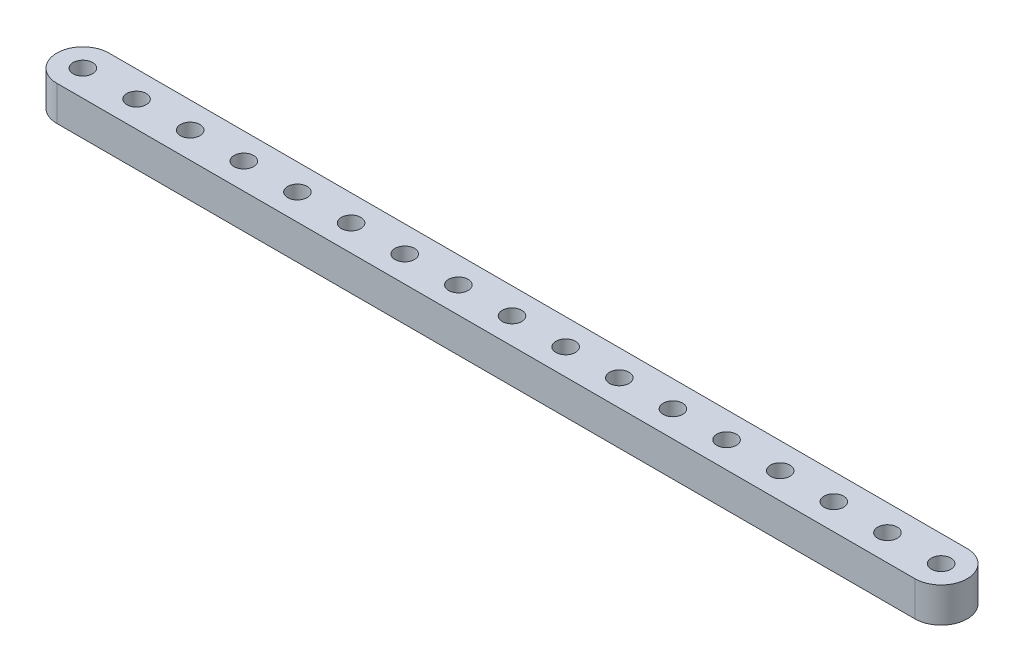
ISO-10303-21;
HEADER;
FILE_DESCRIPTION(('STEP AP214'),'2;1');
FILE_NAME('part.step','',(''),(''),'','','');
FILE_SCHEMA(('AUTOMOTIVE_DESIGN { 1 0 10303 214 1 1 1 1 }'));
ENDSEC;
DATA;
#1=APPLICATION_CONTEXT('core data for automotive mechanical design processes');
#2=APPLICATION_PROTOCOL_DEFINITION('international standard','automotive_design',2000,#1);
#3=PRODUCT_CONTEXT('',#1,'mechanical');
#4=PRODUCT('Part','Part','',(#3));
#5=PRODUCT_RELATED_PRODUCT_CATEGORY('part','',(#4));
#6=PRODUCT_DEFINITION_FORMATION('','',#4);
#7=PRODUCT_DEFINITION_CONTEXT('part definition',#1,'design');
#8=PRODUCT_DEFINITION('design','',#6,#7);
#9=PRODUCT_DEFINITION_SHAPE('','',#8);
#10=(LENGTH_UNIT() NAMED_UNIT(*) SI_UNIT(.MILLI.,.METRE.));
#11=(NAMED_UNIT(*) PLANE_ANGLE_UNIT() SI_UNIT($,.RADIAN.));
#12=(NAMED_UNIT(*) SI_UNIT($,.STERADIAN.) SOLID_ANGLE_UNIT());
#13=UNCERTAINTY_MEASURE_WITH_UNIT(LENGTH_MEASURE(1.E-05),#10,'distance_accuracy_value','');
#14=(GEOMETRIC_REPRESENTATION_CONTEXT(3) GLOBAL_UNCERTAINTY_ASSIGNED_CONTEXT((#13)) GLOBAL_UNIT_ASSIGNED_CONTEXT((#10,
#11,#12)) REPRESENTATION_CONTEXT('',''));
#15=CARTESIAN_POINT('',(0.,0.,0.));
#16=DIRECTION('',(0.,0.,1.));
#17=DIRECTION('',(1.,0.,0.));
#18=AXIS2_PLACEMENT_3D('',#15,#16,#17);
#19=CARTESIAN_POINT('',(78.232,0.,0.));
#20=DIRECTION('',(0.,1.,0.));
#21=DIRECTION('',(0.,0.,1.));
#22=AXIS2_PLACEMENT_3D('',#19,#20,#21);
#23=CYLINDRICAL_SURFACE('',#22,4.76250000000002);
#24=CARTESIAN_POINT('',(78.232,6.35,0.));
#25=DIRECTION('',(0.,1.,0.));
#26=DIRECTION('',(0.,0.,1.));
#27=AXIS2_PLACEMENT_3D('',#24,#25,#26);
#28=CIRCLE('',#27,4.76250000000002);
#29=CARTESIAN_POINT('',(78.232,6.35,4.76250000000002));
#30=VERTEX_POINT('',#29);
#31=CARTESIAN_POINT('',(78.232,6.35,-4.76250000000002));
#32=VERTEX_POINT('',#31);
#33=EDGE_CURVE('E101',#30,#32,#28,.T.);
#34=ORIENTED_EDGE('',*,*,#33,.F.);
#35=DIRECTION('',(0.,1.,0.));
#36=VECTOR('',#35,1.);
#37=CARTESIAN_POINT('',(78.232,0.,4.76250000000002));
#38=LINE('',#37,#36);
#39=CARTESIAN_POINT('',(78.232,0.,4.76250000000002));
#40=VERTEX_POINT('',#39);
#41=EDGE_CURVE('E11',#40,#30,#38,.T.);
#42=ORIENTED_EDGE('',*,*,#41,.F.);
#43=CARTESIAN_POINT('',(78.232,0.,0.));
#44=DIRECTION('',(0.,1.,0.));
#45=DIRECTION('',(0.,0.,1.));
#46=AXIS2_PLACEMENT_3D('',#43,#44,#45);
#47=CIRCLE('',#46,4.76250000000002);
#48=CARTESIAN_POINT('',(78.232,0.,-4.76250000000002));
#49=VERTEX_POINT('',#48);
#50=EDGE_CURVE('E94',#40,#49,#47,.T.);
#51=ORIENTED_EDGE('',*,*,#50,.T.);
#52=DIRECTION('',(0.,1.,0.));
#53=VECTOR('',#52,1.);
#54=CARTESIAN_POINT('',(78.232,0.,-4.76250000000002));
#55=LINE('',#54,#53);
#56=EDGE_CURVE('E39',#49,#32,#55,.T.);
#57=ORIENTED_EDGE('',*,*,#56,.T.);
#58=EDGE_LOOP('',(#34,#42,#51,#57));
#59=FACE_BOUND('',#58,.T.);
#60=ADVANCED_FACE('F36',(#59),#23,.T.);
#61=CARTESIAN_POINT('',(-78.232,0.,4.76250000000002));
#62=DIRECTION('',(0.,0.,1.));
#63=DIRECTION('',(1.,0.,0.));
#64=AXIS2_PLACEMENT_3D('',#61,#62,#63);
#65=PLANE('',#64);
#66=DIRECTION('',(1.,0.,0.));
#67=VECTOR('',#66,1.);
#68=CARTESIAN_POINT('',(-78.232,6.35,4.76250000000002));
#69=LINE('',#68,#67);
#70=CARTESIAN_POINT('',(-78.232,6.35,4.76250000000002));
#71=VERTEX_POINT('',#70);
#72=EDGE_CURVE('E96',#71,#30,#69,.T.);
#73=ORIENTED_EDGE('',*,*,#72,.F.);
#74=DIRECTION('',(0.,1.,0.));
#75=VECTOR('',#74,1.);
#76=CARTESIAN_POINT('',(-78.232,0.,4.76250000000002));
#77=LINE('',#76,#75);
#78=CARTESIAN_POINT('',(-78.232,0.,4.76250000000002));
#79=VERTEX_POINT('',#78);
#80=EDGE_CURVE('E45',#79,#71,#77,.T.);
#81=ORIENTED_EDGE('',*,*,#80,.F.);
#82=DIRECTION('',(1.,0.,0.));
#83=VECTOR('',#82,1.);
#84=CARTESIAN_POINT('',(-78.232,0.,4.76250000000002));
#85=LINE('',#84,#83);
#86=EDGE_CURVE('E91',#79,#40,#85,.T.);
#87=ORIENTED_EDGE('',*,*,#86,.T.);
#88=ORIENTED_EDGE('',*,*,#41,.T.);
#89=EDGE_LOOP('',(#73,#81,#87,#88));
#90=FACE_BOUND('',#89,.T.);
#91=ADVANCED_FACE('F112',(#90),#65,.T.);
#92=CARTESIAN_POINT('',(-78.232,0.,0.));
#93=DIRECTION('',(0.,1.,0.));
#94=DIRECTION('',(0.,0.,1.));
#95=AXIS2_PLACEMENT_3D('',#92,#93,#94);
#96=CYLINDRICAL_SURFACE('',#95,4.76250000000001);
#97=CARTESIAN_POINT('',(-78.232,6.35,0.));
#98=DIRECTION('',(0.,1.,0.));
#99=DIRECTION('',(0.,0.,1.));
#100=AXIS2_PLACEMENT_3D('',#97,#98,#99);
#101=CIRCLE('',#100,4.76250000000001);
#102=CARTESIAN_POINT('',(-78.232,6.35,-4.7625));
#103=VERTEX_POINT('',#102);
#104=EDGE_CURVE('E86',#103,#71,#101,.T.);
#105=ORIENTED_EDGE('',*,*,#104,.F.);
#106=DIRECTION('',(0.,1.,0.));
#107=VECTOR('',#106,1.);
#108=CARTESIAN_POINT('',(-78.232,0.,-4.7625));
#109=LINE('',#108,#107);
#110=CARTESIAN_POINT('',(-78.232,0.,-4.7625));
#111=VERTEX_POINT('',#110);
#112=EDGE_CURVE('E81',#111,#103,#109,.T.);
#113=ORIENTED_EDGE('',*,*,#112,.F.);
#114=CARTESIAN_POINT('',(-78.232,0.,0.));
#115=DIRECTION('',(0.,1.,0.));
#116=DIRECTION('',(0.,0.,1.));
#117=AXIS2_PLACEMENT_3D('',#114,#115,#116);
#118=CIRCLE('',#117,4.76250000000001);
#119=EDGE_CURVE('E84',#111,#79,#118,.T.);
#120=ORIENTED_EDGE('',*,*,#119,.T.);
#121=ORIENTED_EDGE('',*,*,#80,.T.);
#122=EDGE_LOOP('',(#105,#113,#120,#121));
#123=FACE_BOUND('',#122,.T.);
#124=ADVANCED_FACE('F83',(#123),#96,.T.);
#125=CARTESIAN_POINT('',(78.232,0.,-4.76250000000002));
#126=DIRECTION('',(0.,0.,-1.));
#127=DIRECTION('',(-1.,0.,0.));
#128=AXIS2_PLACEMENT_3D('',#125,#126,#127);
#129=PLANE('',#128);
#130=DIRECTION('',(-1.,0.,0.));
#131=VECTOR('',#130,1.);
#132=CARTESIAN_POINT('',(78.232,6.35,-4.76250000000002));
#133=LINE('',#132,#131);
#134=EDGE_CURVE('E104',#32,#103,#133,.T.);
#135=ORIENTED_EDGE('',*,*,#134,.F.);
#136=ORIENTED_EDGE('',*,*,#56,.F.);
#137=DIRECTION('',(-1.,0.,0.));
#138=VECTOR('',#137,1.);
#139=CARTESIAN_POINT('',(78.232,0.,-4.76250000000002));
#140=LINE('',#139,#138);
#141=EDGE_CURVE('E90',#49,#111,#140,.T.);
#142=ORIENTED_EDGE('',*,*,#141,.T.);
#143=ORIENTED_EDGE('',*,*,#112,.T.);
#144=EDGE_LOOP('',(#135,#136,#142,#143));
#145=FACE_BOUND('',#144,.T.);
#146=ADVANCED_FACE('F93',(#145),#129,.T.);
#147=CARTESIAN_POINT('',(78.232,0.,0.));
#148=DIRECTION('',(0.,1.,0.));
#149=DIRECTION('',(0.,0.,1.));
#150=AXIS2_PLACEMENT_3D('',#147,#148,#149);
#151=PLANE('',#150);
#152=CARTESIAN_POINT('',(-78.232,0.,0.));
#153=DIRECTION('',(0.,1.,0.));
#154=DIRECTION('',(0.,0.,-1.));
#155=AXIS2_PLACEMENT_3D('',#152,#153,#154);
#156=CIRCLE('',#155,1.77799999999997);
#157=CARTESIAN_POINT('',(-78.232,0.,-1.77799999999996));
#158=VERTEX_POINT('',#157);
#159=EDGE_CURVE('E205',#158,#158,#156,.T.);
#160=ORIENTED_EDGE('',*,*,#159,.T.);
#161=EDGE_LOOP('',(#160));
#162=FACE_BOUND('',#161,.T.);
#163=CARTESIAN_POINT('',(-68.453,0.,0.));
#164=DIRECTION('',(0.,1.,0.));
#165=DIRECTION('',(0.,0.,-1.));
#166=AXIS2_PLACEMENT_3D('',#163,#164,#165);
#167=CIRCLE('',#166,1.77799999999999);
#168=CARTESIAN_POINT('',(-68.453,0.,-1.77799999999999));
#169=VERTEX_POINT('',#168);
#170=EDGE_CURVE('E213',#169,#169,#167,.T.);
#171=ORIENTED_EDGE('',*,*,#170,.T.);
#172=EDGE_LOOP('',(#171));
#173=FACE_BOUND('',#172,.T.);
#174=CARTESIAN_POINT('',(-58.674,0.,0.));
#175=DIRECTION('',(0.,1.,0.));
#176=DIRECTION('',(0.,0.,-1.));
#177=AXIS2_PLACEMENT_3D('',#174,#175,#176);
#178=CIRCLE('',#177,1.77799999999999);
#179=CARTESIAN_POINT('',(-58.674,0.,-1.77799999999999));
#180=VERTEX_POINT('',#179);
#181=EDGE_CURVE('E219',#180,#180,#178,.T.);
#182=ORIENTED_EDGE('',*,*,#181,.T.);
#183=EDGE_LOOP('',(#182));
#184=FACE_BOUND('',#183,.T.);
#185=CARTESIAN_POINT('',(-48.895,0.,0.));
#186=DIRECTION('',(0.,1.,0.));
#187=DIRECTION('',(0.,0.,-1.));
#188=AXIS2_PLACEMENT_3D('',#185,#186,#187);
#189=CIRCLE('',#188,1.77799999999999);
#190=CARTESIAN_POINT('',(-48.895,0.,-1.77799999999999));
#191=VERTEX_POINT('',#190);
#192=EDGE_CURVE('E225',#191,#191,#189,.T.);
#193=ORIENTED_EDGE('',*,*,#192,.T.);
#194=EDGE_LOOP('',(#193));
#195=FACE_BOUND('',#194,.T.);
#196=CARTESIAN_POINT('',(-39.116,0.,0.));
#197=DIRECTION('',(0.,1.,0.));
#198=DIRECTION('',(0.,0.,-1.));
#199=AXIS2_PLACEMENT_3D('',#196,#197,#198);
#200=CIRCLE('',#199,1.77799999999999);
#201=CARTESIAN_POINT('',(-39.116,0.,-1.77799999999999));
#202=VERTEX_POINT('',#201);
#203=EDGE_CURVE('E231',#202,#202,#200,.T.);
#204=ORIENTED_EDGE('',*,*,#203,.T.);
#205=EDGE_LOOP('',(#204));
#206=FACE_BOUND('',#205,.T.);
#207=CARTESIAN_POINT('',(-29.337,0.,0.));
#208=DIRECTION('',(0.,1.,0.));
#209=DIRECTION('',(0.,0.,-1.));
#210=AXIS2_PLACEMENT_3D('',#207,#208,#209);
#211=CIRCLE('',#210,1.77799999999999);
#212=CARTESIAN_POINT('',(-29.337,0.,-1.77799999999998));
#213=VERTEX_POINT('',#212);
#214=EDGE_CURVE('E237',#213,#213,#211,.T.);
#215=ORIENTED_EDGE('',*,*,#214,.T.);
#216=EDGE_LOOP('',(#215));
#217=FACE_BOUND('',#216,.T.);
#218=CARTESIAN_POINT('',(-19.558,0.,0.));
#219=DIRECTION('',(0.,1.,0.));
#220=DIRECTION('',(0.,0.,-1.));
#221=AXIS2_PLACEMENT_3D('',#218,#219,#220);
#222=CIRCLE('',#221,1.77799999999999);
#223=CARTESIAN_POINT('',(-19.558,0.,-1.77799999999998));
#224=VERTEX_POINT('',#223);
#225=EDGE_CURVE('E243',#224,#224,#222,.T.);
#226=ORIENTED_EDGE('',*,*,#225,.T.);
#227=EDGE_LOOP('',(#226));
#228=FACE_BOUND('',#227,.T.);
#229=CARTESIAN_POINT('',(-9.77900000000001,0.,0.));
#230=DIRECTION('',(0.,1.,0.));
#231=DIRECTION('',(0.,0.,-1.));
#232=AXIS2_PLACEMENT_3D('',#229,#230,#231);
#233=CIRCLE('',#232,1.77799999999999);
#234=CARTESIAN_POINT('',(-9.77900000000001,0.,-1.77799999999998));
#235=VERTEX_POINT('',#234);
#236=EDGE_CURVE('E249',#235,#235,#233,.T.);
#237=ORIENTED_EDGE('',*,*,#236,.T.);
#238=EDGE_LOOP('',(#237));
#239=FACE_BOUND('',#238,.T.);
#240=CARTESIAN_POINT('',(0.,0.,0.));
#241=DIRECTION('',(0.,1.,0.));
#242=DIRECTION('',(0.,0.,-1.));
#243=AXIS2_PLACEMENT_3D('',#240,#241,#242);
#244=CIRCLE('',#243,1.77799999999999);
#245=CARTESIAN_POINT('',(0.,0.,-1.77799999999998));
#246=VERTEX_POINT('',#245);
#247=EDGE_CURVE('E255',#246,#246,#244,.T.);
#248=ORIENTED_EDGE('',*,*,#247,.T.);
#249=EDGE_LOOP('',(#248));
#250=FACE_BOUND('',#249,.T.);
#251=CARTESIAN_POINT('',(9.77899999999998,0.,0.));
#252=DIRECTION('',(0.,1.,0.));
#253=DIRECTION('',(0.,0.,-1.));
#254=AXIS2_PLACEMENT_3D('',#251,#252,#253);
#255=CIRCLE('',#254,1.77799999999999);
#256=CARTESIAN_POINT('',(9.77899999999998,0.,-1.77799999999998));
#257=VERTEX_POINT('',#256);
#258=EDGE_CURVE('E261',#257,#257,#255,.T.);
#259=ORIENTED_EDGE('',*,*,#258,.T.);
#260=EDGE_LOOP('',(#259));
#261=FACE_BOUND('',#260,.T.);
#262=CARTESIAN_POINT('',(19.558,0.,0.));
#263=DIRECTION('',(0.,1.,0.));
#264=DIRECTION('',(0.,0.,-1.));
#265=AXIS2_PLACEMENT_3D('',#262,#263,#264);
#266=CIRCLE('',#265,1.77799999999999);
#267=CARTESIAN_POINT('',(19.558,0.,-1.77799999999998));
#268=VERTEX_POINT('',#267);
#269=EDGE_CURVE('E267',#268,#268,#266,.T.);
#270=ORIENTED_EDGE('',*,*,#269,.T.);
#271=EDGE_LOOP('',(#270));
#272=FACE_BOUND('',#271,.T.);
#273=CARTESIAN_POINT('',(29.337,0.,0.));
#274=DIRECTION('',(0.,1.,0.));
#275=DIRECTION('',(0.,0.,-1.));
#276=AXIS2_PLACEMENT_3D('',#273,#274,#275);
#277=CIRCLE('',#276,1.77799999999999);
#278=CARTESIAN_POINT('',(29.337,0.,-1.77799999999998));
#279=VERTEX_POINT('',#278);
#280=EDGE_CURVE('E273',#279,#279,#277,.T.);
#281=ORIENTED_EDGE('',*,*,#280,.T.);
#282=EDGE_LOOP('',(#281));
#283=FACE_BOUND('',#282,.T.);
#284=CARTESIAN_POINT('',(39.116,0.,0.));
#285=DIRECTION('',(0.,1.,0.));
#286=DIRECTION('',(0.,0.,-1.));
#287=AXIS2_PLACEMENT_3D('',#284,#285,#286);
#288=CIRCLE('',#287,1.77799999999999);
#289=CARTESIAN_POINT('',(39.116,0.,-1.77799999999998));
#290=VERTEX_POINT('',#289);
#291=EDGE_CURVE('E279',#290,#290,#288,.T.);
#292=ORIENTED_EDGE('',*,*,#291,.T.);
#293=EDGE_LOOP('',(#292));
#294=FACE_BOUND('',#293,.T.);
#295=CARTESIAN_POINT('',(48.895,0.,0.));
#296=DIRECTION('',(0.,1.,0.));
#297=DIRECTION('',(0.,0.,-1.));
#298=AXIS2_PLACEMENT_3D('',#295,#296,#297);
#299=CIRCLE('',#298,1.77799999999999);
#300=CARTESIAN_POINT('',(48.895,0.,-1.77799999999998));
#301=VERTEX_POINT('',#300);
#302=EDGE_CURVE('E285',#301,#301,#299,.T.);
#303=ORIENTED_EDGE('',*,*,#302,.T.);
#304=EDGE_LOOP('',(#303));
#305=FACE_BOUND('',#304,.T.);
#306=CARTESIAN_POINT('',(58.674,0.,0.));
#307=DIRECTION('',(0.,1.,0.));
#308=DIRECTION('',(0.,0.,-1.));
#309=AXIS2_PLACEMENT_3D('',#306,#307,#308);
#310=CIRCLE('',#309,1.77799999999999);
#311=CARTESIAN_POINT('',(58.674,0.,-1.77799999999998));
#312=VERTEX_POINT('',#311);
#313=EDGE_CURVE('E291',#312,#312,#310,.T.);
#314=ORIENTED_EDGE('',*,*,#313,.T.);
#315=EDGE_LOOP('',(#314));
#316=FACE_BOUND('',#315,.T.);
#317=CARTESIAN_POINT('',(68.453,0.,0.));
#318=DIRECTION('',(0.,1.,0.));
#319=DIRECTION('',(0.,0.,-1.));
#320=AXIS2_PLACEMENT_3D('',#317,#318,#319);
#321=CIRCLE('',#320,1.77799999999999);
#322=CARTESIAN_POINT('',(68.453,0.,-1.77799999999997));
#323=VERTEX_POINT('',#322);
#324=EDGE_CURVE('E297',#323,#323,#321,.T.);
#325=ORIENTED_EDGE('',*,*,#324,.T.);
#326=EDGE_LOOP('',(#325));
#327=FACE_BOUND('',#326,.T.);
#328=CARTESIAN_POINT('',(78.232,0.,0.));
#329=DIRECTION('',(0.,1.,0.));
#330=DIRECTION('',(0.,0.,-1.));
#331=AXIS2_PLACEMENT_3D('',#328,#329,#330);
#332=CIRCLE('',#331,1.77799999999999);
#333=CARTESIAN_POINT('',(78.232,0.,-1.77799999999997));
#334=VERTEX_POINT('',#333);
#335=EDGE_CURVE('E105',#334,#334,#332,.T.);
#336=ORIENTED_EDGE('',*,*,#335,.T.);
#337=EDGE_LOOP('',(#336));
#338=FACE_BOUND('',#337,.T.);
#339=ORIENTED_EDGE('',*,*,#50,.F.);
#340=ORIENTED_EDGE('',*,*,#86,.F.);
#341=ORIENTED_EDGE('',*,*,#119,.F.);
#342=ORIENTED_EDGE('',*,*,#141,.F.);
#343=EDGE_LOOP('',(#339,#340,#341,#342));
#344=FACE_BOUND('',#343,.T.);
#345=ADVANCED_FACE('F89',(#162,#173,#184,#195,#206,#217,#228,#239,#250,#261,#272,#283,#294,#305,
#316,#327,#338,#344),#151,.F.);
#346=CARTESIAN_POINT('',(78.232,6.35,0.));
#347=DIRECTION('',(0.,1.,0.));
#348=DIRECTION('',(0.,0.,1.));
#349=AXIS2_PLACEMENT_3D('',#346,#347,#348);
#350=PLANE('',#349);
#351=CARTESIAN_POINT('',(-78.232,6.35,0.));
#352=DIRECTION('',(0.,1.,0.));
#353=DIRECTION('',(0.,0.,-1.));
#354=AXIS2_PLACEMENT_3D('',#351,#352,#353);
#355=CIRCLE('',#354,1.77799999999997);
#356=CARTESIAN_POINT('',(-78.232,6.35,-1.77799999999996));
#357=VERTEX_POINT('',#356);
#358=EDGE_CURVE('E208',#357,#357,#355,.T.);
#359=ORIENTED_EDGE('',*,*,#358,.F.);
#360=EDGE_LOOP('',(#359));
#361=FACE_BOUND('',#360,.T.);
#362=CARTESIAN_POINT('',(-68.453,6.35,0.));
#363=DIRECTION('',(0.,1.,0.));
#364=DIRECTION('',(0.,0.,-1.));
#365=AXIS2_PLACEMENT_3D('',#362,#363,#364);
#366=CIRCLE('',#365,1.77799999999999);
#367=CARTESIAN_POINT('',(-68.453,6.35,-1.77799999999999));
#368=VERTEX_POINT('',#367);
#369=EDGE_CURVE('E210',#368,#368,#366,.T.);
#370=ORIENTED_EDGE('',*,*,#369,.F.);
#371=EDGE_LOOP('',(#370));
#372=FACE_BOUND('',#371,.T.);
#373=CARTESIAN_POINT('',(-58.674,6.35,0.));
#374=DIRECTION('',(0.,1.,0.));
#375=DIRECTION('',(0.,0.,-1.));
#376=AXIS2_PLACEMENT_3D('',#373,#374,#375);
#377=CIRCLE('',#376,1.77799999999999);
#378=CARTESIAN_POINT('',(-58.674,6.35,-1.77799999999999));
#379=VERTEX_POINT('',#378);
#380=EDGE_CURVE('E216',#379,#379,#377,.T.);
#381=ORIENTED_EDGE('',*,*,#380,.F.);
#382=EDGE_LOOP('',(#381));
#383=FACE_BOUND('',#382,.T.);
#384=CARTESIAN_POINT('',(-48.895,6.35,0.));
#385=DIRECTION('',(0.,1.,0.));
#386=DIRECTION('',(0.,0.,-1.));
#387=AXIS2_PLACEMENT_3D('',#384,#385,#386);
#388=CIRCLE('',#387,1.77799999999999);
#389=CARTESIAN_POINT('',(-48.895,6.35,-1.77799999999999));
#390=VERTEX_POINT('',#389);
#391=EDGE_CURVE('E222',#390,#390,#388,.T.);
#392=ORIENTED_EDGE('',*,*,#391,.F.);
#393=EDGE_LOOP('',(#392));
#394=FACE_BOUND('',#393,.T.);
#395=CARTESIAN_POINT('',(-39.116,6.35,0.));
#396=DIRECTION('',(0.,1.,0.));
#397=DIRECTION('',(0.,0.,-1.));
#398=AXIS2_PLACEMENT_3D('',#395,#396,#397);
#399=CIRCLE('',#398,1.77799999999999);
#400=CARTESIAN_POINT('',(-39.116,6.35,-1.77799999999999));
#401=VERTEX_POINT('',#400);
#402=EDGE_CURVE('E228',#401,#401,#399,.T.);
#403=ORIENTED_EDGE('',*,*,#402,.F.);
#404=EDGE_LOOP('',(#403));
#405=FACE_BOUND('',#404,.T.);
#406=CARTESIAN_POINT('',(-29.337,6.35,0.));
#407=DIRECTION('',(0.,1.,0.));
#408=DIRECTION('',(0.,0.,-1.));
#409=AXIS2_PLACEMENT_3D('',#406,#407,#408);
#410=CIRCLE('',#409,1.77799999999999);
#411=CARTESIAN_POINT('',(-29.337,6.35,-1.77799999999998));
#412=VERTEX_POINT('',#411);
#413=EDGE_CURVE('E234',#412,#412,#410,.T.);
#414=ORIENTED_EDGE('',*,*,#413,.F.);
#415=EDGE_LOOP('',(#414));
#416=FACE_BOUND('',#415,.T.);
#417=CARTESIAN_POINT('',(-19.558,6.35,0.));
#418=DIRECTION('',(0.,1.,0.));
#419=DIRECTION('',(0.,0.,-1.));
#420=AXIS2_PLACEMENT_3D('',#417,#418,#419);
#421=CIRCLE('',#420,1.77799999999999);
#422=CARTESIAN_POINT('',(-19.558,6.35,-1.77799999999998));
#423=VERTEX_POINT('',#422);
#424=EDGE_CURVE('E240',#423,#423,#421,.T.);
#425=ORIENTED_EDGE('',*,*,#424,.F.);
#426=EDGE_LOOP('',(#425));
#427=FACE_BOUND('',#426,.T.);
#428=CARTESIAN_POINT('',(-9.77900000000001,6.35,0.));
#429=DIRECTION('',(0.,1.,0.));
#430=DIRECTION('',(0.,0.,-1.));
#431=AXIS2_PLACEMENT_3D('',#428,#429,#430);
#432=CIRCLE('',#431,1.77799999999999);
#433=CARTESIAN_POINT('',(-9.77900000000001,6.35,-1.77799999999998));
#434=VERTEX_POINT('',#433);
#435=EDGE_CURVE('E246',#434,#434,#432,.T.);
#436=ORIENTED_EDGE('',*,*,#435,.F.);
#437=EDGE_LOOP('',(#436));
#438=FACE_BOUND('',#437,.T.);
#439=CARTESIAN_POINT('',(0.,6.35,0.));
#440=DIRECTION('',(0.,1.,0.));
#441=DIRECTION('',(0.,0.,-1.));
#442=AXIS2_PLACEMENT_3D('',#439,#440,#441);
#443=CIRCLE('',#442,1.77799999999999);
#444=CARTESIAN_POINT('',(0.,6.35,-1.77799999999998));
#445=VERTEX_POINT('',#444);
#446=EDGE_CURVE('E252',#445,#445,#443,.T.);
#447=ORIENTED_EDGE('',*,*,#446,.F.);
#448=EDGE_LOOP('',(#447));
#449=FACE_BOUND('',#448,.T.);
#450=CARTESIAN_POINT('',(9.77899999999998,6.35,0.));
#451=DIRECTION('',(0.,1.,0.));
#452=DIRECTION('',(0.,0.,-1.));
#453=AXIS2_PLACEMENT_3D('',#450,#451,#452);
#454=CIRCLE('',#453,1.77799999999999);
#455=CARTESIAN_POINT('',(9.77899999999998,6.35,-1.77799999999998));
#456=VERTEX_POINT('',#455);
#457=EDGE_CURVE('E258',#456,#456,#454,.T.);
#458=ORIENTED_EDGE('',*,*,#457,.F.);
#459=EDGE_LOOP('',(#458));
#460=FACE_BOUND('',#459,.T.);
#461=CARTESIAN_POINT('',(19.558,6.35,0.));
#462=DIRECTION('',(0.,1.,0.));
#463=DIRECTION('',(0.,0.,-1.));
#464=AXIS2_PLACEMENT_3D('',#461,#462,#463);
#465=CIRCLE('',#464,1.77799999999999);
#466=CARTESIAN_POINT('',(19.558,6.35,-1.77799999999998));
#467=VERTEX_POINT('',#466);
#468=EDGE_CURVE('E264',#467,#467,#465,.T.);
#469=ORIENTED_EDGE('',*,*,#468,.F.);
#470=EDGE_LOOP('',(#469));
#471=FACE_BOUND('',#470,.T.);
#472=CARTESIAN_POINT('',(29.337,6.35,0.));
#473=DIRECTION('',(0.,1.,0.));
#474=DIRECTION('',(0.,0.,-1.));
#475=AXIS2_PLACEMENT_3D('',#472,#473,#474);
#476=CIRCLE('',#475,1.77799999999999);
#477=CARTESIAN_POINT('',(29.337,6.35,-1.77799999999998));
#478=VERTEX_POINT('',#477);
#479=EDGE_CURVE('E270',#478,#478,#476,.T.);
#480=ORIENTED_EDGE('',*,*,#479,.F.);
#481=EDGE_LOOP('',(#480));
#482=FACE_BOUND('',#481,.T.);
#483=CARTESIAN_POINT('',(39.116,6.35,0.));
#484=DIRECTION('',(0.,1.,0.));
#485=DIRECTION('',(0.,0.,-1.));
#486=AXIS2_PLACEMENT_3D('',#483,#484,#485);
#487=CIRCLE('',#486,1.77799999999999);
#488=CARTESIAN_POINT('',(39.116,6.35,-1.77799999999998));
#489=VERTEX_POINT('',#488);
#490=EDGE_CURVE('E276',#489,#489,#487,.T.);
#491=ORIENTED_EDGE('',*,*,#490,.F.);
#492=EDGE_LOOP('',(#491));
#493=FACE_BOUND('',#492,.T.);
#494=CARTESIAN_POINT('',(48.895,6.35,0.));
#495=DIRECTION('',(0.,1.,0.));
#496=DIRECTION('',(0.,0.,-1.));
#497=AXIS2_PLACEMENT_3D('',#494,#495,#496);
#498=CIRCLE('',#497,1.77799999999999);
#499=CARTESIAN_POINT('',(48.895,6.35,-1.77799999999998));
#500=VERTEX_POINT('',#499);
#501=EDGE_CURVE('E282',#500,#500,#498,.T.);
#502=ORIENTED_EDGE('',*,*,#501,.F.);
#503=EDGE_LOOP('',(#502));
#504=FACE_BOUND('',#503,.T.);
#505=CARTESIAN_POINT('',(58.674,6.35,0.));
#506=DIRECTION('',(0.,1.,0.));
#507=DIRECTION('',(0.,0.,-1.));
#508=AXIS2_PLACEMENT_3D('',#505,#506,#507);
#509=CIRCLE('',#508,1.77799999999999);
#510=CARTESIAN_POINT('',(58.674,6.35,-1.77799999999998));
#511=VERTEX_POINT('',#510);
#512=EDGE_CURVE('E288',#511,#511,#509,.T.);
#513=ORIENTED_EDGE('',*,*,#512,.F.);
#514=EDGE_LOOP('',(#513));
#515=FACE_BOUND('',#514,.T.);
#516=CARTESIAN_POINT('',(68.453,6.35,0.));
#517=DIRECTION('',(0.,1.,0.));
#518=DIRECTION('',(0.,0.,-1.));
#519=AXIS2_PLACEMENT_3D('',#516,#517,#518);
#520=CIRCLE('',#519,1.77799999999999);
#521=CARTESIAN_POINT('',(68.453,6.35,-1.77799999999997));
#522=VERTEX_POINT('',#521);
#523=EDGE_CURVE('E294',#522,#522,#520,.T.);
#524=ORIENTED_EDGE('',*,*,#523,.F.);
#525=EDGE_LOOP('',(#524));
#526=FACE_BOUND('',#525,.T.);
#527=CARTESIAN_POINT('',(78.232,6.35,0.));
#528=DIRECTION('',(0.,1.,0.));
#529=DIRECTION('',(0.,0.,-1.));
#530=AXIS2_PLACEMENT_3D('',#527,#528,#529);
#531=CIRCLE('',#530,1.77799999999999);
#532=CARTESIAN_POINT('',(78.232,6.35,-1.77799999999997));
#533=VERTEX_POINT('',#532);
#534=EDGE_CURVE('E300',#533,#533,#531,.T.);
#535=ORIENTED_EDGE('',*,*,#534,.F.);
#536=EDGE_LOOP('',(#535));
#537=FACE_BOUND('',#536,.T.);
#538=ORIENTED_EDGE('',*,*,#33,.T.);
#539=ORIENTED_EDGE('',*,*,#134,.T.);
#540=ORIENTED_EDGE('',*,*,#104,.T.);
#541=ORIENTED_EDGE('',*,*,#72,.T.);
#542=EDGE_LOOP('',(#538,#539,#540,#541));
#543=FACE_BOUND('',#542,.T.);
#544=ADVANCED_FACE('F111',(#361,#372,#383,#394,#405,#416,#427,#438,#449,#460,#471,#482,#493,
#504,#515,#526,#537,#543),#350,.T.);
#545=CARTESIAN_POINT('',(78.232,0.,0.));
#546=DIRECTION('',(0.,1.,0.));
#547=DIRECTION('',(0.,0.,1.));
#548=AXIS2_PLACEMENT_3D('',#545,#546,#547);
#549=CYLINDRICAL_SURFACE('',#548,1.77799999999999);
#550=ORIENTED_EDGE('',*,*,#335,.F.);
#551=EDGE_LOOP('',(#550));
#552=FACE_BOUND('',#551,.T.);
#553=ORIENTED_EDGE('',*,*,#534,.T.);
#554=EDGE_LOOP('',(#553));
#555=FACE_BOUND('',#554,.T.);
#556=ADVANCED_FACE('F130',(#552,#555),#549,.F.);
#557=CARTESIAN_POINT('',(68.453,0.,0.));
#558=DIRECTION('',(0.,1.,0.));
#559=DIRECTION('',(0.,0.,1.));
#560=AXIS2_PLACEMENT_3D('',#557,#558,#559);
#561=CYLINDRICAL_SURFACE('',#560,1.77799999999999);
#562=ORIENTED_EDGE('',*,*,#324,.F.);
#563=EDGE_LOOP('',(#562));
#564=FACE_BOUND('',#563,.T.);
#565=ORIENTED_EDGE('',*,*,#523,.T.);
#566=EDGE_LOOP('',(#565));
#567=FACE_BOUND('',#566,.T.);
#568=ADVANCED_FACE('F137',(#564,#567),#561,.F.);
#569=CARTESIAN_POINT('',(58.674,0.,0.));
#570=DIRECTION('',(0.,1.,0.));
#571=DIRECTION('',(0.,0.,1.));
#572=AXIS2_PLACEMENT_3D('',#569,#570,#571);
#573=CYLINDRICAL_SURFACE('',#572,1.77799999999999);
#574=ORIENTED_EDGE('',*,*,#313,.F.);
#575=EDGE_LOOP('',(#574));
#576=FACE_BOUND('',#575,.T.);
#577=ORIENTED_EDGE('',*,*,#512,.T.);
#578=EDGE_LOOP('',(#577));
#579=FACE_BOUND('',#578,.T.);
#580=ADVANCED_FACE('F141',(#576,#579),#573,.F.);
#581=CARTESIAN_POINT('',(48.895,0.,0.));
#582=DIRECTION('',(0.,1.,0.));
#583=DIRECTION('',(0.,0.,1.));
#584=AXIS2_PLACEMENT_3D('',#581,#582,#583);
#585=CYLINDRICAL_SURFACE('',#584,1.77799999999999);
#586=ORIENTED_EDGE('',*,*,#302,.F.);
#587=EDGE_LOOP('',(#586));
#588=FACE_BOUND('',#587,.T.);
#589=ORIENTED_EDGE('',*,*,#501,.T.);
#590=EDGE_LOOP('',(#589));
#591=FACE_BOUND('',#590,.T.);
#592=ADVANCED_FACE('F145',(#588,#591),#585,.F.);
#593=CARTESIAN_POINT('',(39.116,0.,0.));
#594=DIRECTION('',(0.,1.,0.));
#595=DIRECTION('',(0.,0.,1.));
#596=AXIS2_PLACEMENT_3D('',#593,#594,#595);
#597=CYLINDRICAL_SURFACE('',#596,1.77799999999999);
#598=ORIENTED_EDGE('',*,*,#291,.F.);
#599=EDGE_LOOP('',(#598));
#600=FACE_BOUND('',#599,.T.);
#601=ORIENTED_EDGE('',*,*,#490,.T.);
#602=EDGE_LOOP('',(#601));
#603=FACE_BOUND('',#602,.T.);
#604=ADVANCED_FACE('F149',(#600,#603),#597,.F.);
#605=CARTESIAN_POINT('',(29.337,0.,0.));
#606=DIRECTION('',(0.,1.,0.));
#607=DIRECTION('',(0.,0.,1.));
#608=AXIS2_PLACEMENT_3D('',#605,#606,#607);
#609=CYLINDRICAL_SURFACE('',#608,1.77799999999999);
#610=ORIENTED_EDGE('',*,*,#280,.F.);
#611=EDGE_LOOP('',(#610));
#612=FACE_BOUND('',#611,.T.);
#613=ORIENTED_EDGE('',*,*,#479,.T.);
#614=EDGE_LOOP('',(#613));
#615=FACE_BOUND('',#614,.T.);
#616=ADVANCED_FACE('F153',(#612,#615),#609,.F.);
#617=CARTESIAN_POINT('',(19.558,0.,0.));
#618=DIRECTION('',(0.,1.,0.));
#619=DIRECTION('',(0.,0.,1.));
#620=AXIS2_PLACEMENT_3D('',#617,#618,#619);
#621=CYLINDRICAL_SURFACE('',#620,1.77799999999999);
#622=ORIENTED_EDGE('',*,*,#269,.F.);
#623=EDGE_LOOP('',(#622));
#624=FACE_BOUND('',#623,.T.);
#625=ORIENTED_EDGE('',*,*,#468,.T.);
#626=EDGE_LOOP('',(#625));
#627=FACE_BOUND('',#626,.T.);
#628=ADVANCED_FACE('F157',(#624,#627),#621,.F.);
#629=CARTESIAN_POINT('',(9.77899999999998,0.,0.));
#630=DIRECTION('',(0.,1.,0.));
#631=DIRECTION('',(0.,0.,1.));
#632=AXIS2_PLACEMENT_3D('',#629,#630,#631);
#633=CYLINDRICAL_SURFACE('',#632,1.77799999999999);
#634=ORIENTED_EDGE('',*,*,#258,.F.);
#635=EDGE_LOOP('',(#634));
#636=FACE_BOUND('',#635,.T.);
#637=ORIENTED_EDGE('',*,*,#457,.T.);
#638=EDGE_LOOP('',(#637));
#639=FACE_BOUND('',#638,.T.);
#640=ADVANCED_FACE('F161',(#636,#639),#633,.F.);
#641=CARTESIAN_POINT('',(0.,0.,0.));
#642=DIRECTION('',(0.,1.,0.));
#643=DIRECTION('',(0.,0.,1.));
#644=AXIS2_PLACEMENT_3D('',#641,#642,#643);
#645=CYLINDRICAL_SURFACE('',#644,1.77799999999999);
#646=ORIENTED_EDGE('',*,*,#247,.F.);
#647=EDGE_LOOP('',(#646));
#648=FACE_BOUND('',#647,.T.);
#649=ORIENTED_EDGE('',*,*,#446,.T.);
#650=EDGE_LOOP('',(#649));
#651=FACE_BOUND('',#650,.T.);
#652=ADVANCED_FACE('F165',(#648,#651),#645,.F.);
#653=CARTESIAN_POINT('',(-9.77900000000001,0.,0.));
#654=DIRECTION('',(0.,1.,0.));
#655=DIRECTION('',(0.,0.,1.));
#656=AXIS2_PLACEMENT_3D('',#653,#654,#655);
#657=CYLINDRICAL_SURFACE('',#656,1.77799999999999);
#658=ORIENTED_EDGE('',*,*,#236,.F.);
#659=EDGE_LOOP('',(#658));
#660=FACE_BOUND('',#659,.T.);
#661=ORIENTED_EDGE('',*,*,#435,.T.);
#662=EDGE_LOOP('',(#661));
#663=FACE_BOUND('',#662,.T.);
#664=ADVANCED_FACE('F169',(#660,#663),#657,.F.);
#665=CARTESIAN_POINT('',(-19.558,0.,0.));
#666=DIRECTION('',(0.,1.,0.));
#667=DIRECTION('',(0.,0.,1.));
#668=AXIS2_PLACEMENT_3D('',#665,#666,#667);
#669=CYLINDRICAL_SURFACE('',#668,1.77799999999999);
#670=ORIENTED_EDGE('',*,*,#225,.F.);
#671=EDGE_LOOP('',(#670));
#672=FACE_BOUND('',#671,.T.);
#673=ORIENTED_EDGE('',*,*,#424,.T.);
#674=EDGE_LOOP('',(#673));
#675=FACE_BOUND('',#674,.T.);
#676=ADVANCED_FACE('F173',(#672,#675),#669,.F.);
#677=CARTESIAN_POINT('',(-29.337,0.,0.));
#678=DIRECTION('',(0.,1.,0.));
#679=DIRECTION('',(0.,0.,1.));
#680=AXIS2_PLACEMENT_3D('',#677,#678,#679);
#681=CYLINDRICAL_SURFACE('',#680,1.77799999999999);
#682=ORIENTED_EDGE('',*,*,#214,.F.);
#683=EDGE_LOOP('',(#682));
#684=FACE_BOUND('',#683,.T.);
#685=ORIENTED_EDGE('',*,*,#413,.T.);
#686=EDGE_LOOP('',(#685));
#687=FACE_BOUND('',#686,.T.);
#688=ADVANCED_FACE('F177',(#684,#687),#681,.F.);
#689=CARTESIAN_POINT('',(-39.116,0.,0.));
#690=DIRECTION('',(0.,1.,0.));
#691=DIRECTION('',(0.,0.,1.));
#692=AXIS2_PLACEMENT_3D('',#689,#690,#691);
#693=CYLINDRICAL_SURFACE('',#692,1.77799999999999);
#694=ORIENTED_EDGE('',*,*,#203,.F.);
#695=EDGE_LOOP('',(#694));
#696=FACE_BOUND('',#695,.T.);
#697=ORIENTED_EDGE('',*,*,#402,.T.);
#698=EDGE_LOOP('',(#697));
#699=FACE_BOUND('',#698,.T.);
#700=ADVANCED_FACE('F181',(#696,#699),#693,.F.);
#701=CARTESIAN_POINT('',(-48.895,0.,0.));
#702=DIRECTION('',(0.,1.,0.));
#703=DIRECTION('',(0.,0.,1.));
#704=AXIS2_PLACEMENT_3D('',#701,#702,#703);
#705=CYLINDRICAL_SURFACE('',#704,1.77799999999999);
#706=ORIENTED_EDGE('',*,*,#192,.F.);
#707=EDGE_LOOP('',(#706));
#708=FACE_BOUND('',#707,.T.);
#709=ORIENTED_EDGE('',*,*,#391,.T.);
#710=EDGE_LOOP('',(#709));
#711=FACE_BOUND('',#710,.T.);
#712=ADVANCED_FACE('F185',(#708,#711),#705,.F.);
#713=CARTESIAN_POINT('',(-58.674,0.,0.));
#714=DIRECTION('',(0.,1.,0.));
#715=DIRECTION('',(0.,0.,1.));
#716=AXIS2_PLACEMENT_3D('',#713,#714,#715);
#717=CYLINDRICAL_SURFACE('',#716,1.77799999999999);
#718=ORIENTED_EDGE('',*,*,#181,.F.);
#719=EDGE_LOOP('',(#718));
#720=FACE_BOUND('',#719,.T.);
#721=ORIENTED_EDGE('',*,*,#380,.T.);
#722=EDGE_LOOP('',(#721));
#723=FACE_BOUND('',#722,.T.);
#724=ADVANCED_FACE('F189',(#720,#723),#717,.F.);
#725=CARTESIAN_POINT('',(-68.453,0.,0.));
#726=DIRECTION('',(0.,1.,0.));
#727=DIRECTION('',(0.,0.,1.));
#728=AXIS2_PLACEMENT_3D('',#725,#726,#727);
#729=CYLINDRICAL_SURFACE('',#728,1.77799999999999);
#730=ORIENTED_EDGE('',*,*,#170,.F.);
#731=EDGE_LOOP('',(#730));
#732=FACE_BOUND('',#731,.T.);
#733=ORIENTED_EDGE('',*,*,#369,.T.);
#734=EDGE_LOOP('',(#733));
#735=FACE_BOUND('',#734,.T.);
#736=ADVANCED_FACE('F193',(#732,#735),#729,.F.);
#737=CARTESIAN_POINT('',(-78.232,0.,0.));
#738=DIRECTION('',(0.,1.,0.));
#739=DIRECTION('',(0.,0.,1.));
#740=AXIS2_PLACEMENT_3D('',#737,#738,#739);
#741=CYLINDRICAL_SURFACE('',#740,1.77799999999997);
#742=ORIENTED_EDGE('',*,*,#159,.F.);
#743=EDGE_LOOP('',(#742));
#744=FACE_BOUND('',#743,.T.);
#745=ORIENTED_EDGE('',*,*,#358,.T.);
#746=EDGE_LOOP('',(#745));
#747=FACE_BOUND('',#746,.T.);
#748=ADVANCED_FACE('F197',(#744,#747),#741,.F.);
#749=CLOSED_SHELL('',(#60,#91,#124,#146,#345,#544,#556,#568,#580,#592,#604,#616,#628,#640,#652,
#664,#676,#688,#700,#712,#724,#736,#748));
#750=MANIFOLD_SOLID_BREP('B2',#749);
#751=ADVANCED_BREP_SHAPE_REPRESENTATION('',(#18,#750),#14);
#752=SHAPE_DEFINITION_REPRESENTATION(#9,#751);
ENDSEC;
END-ISO-10303-21;
